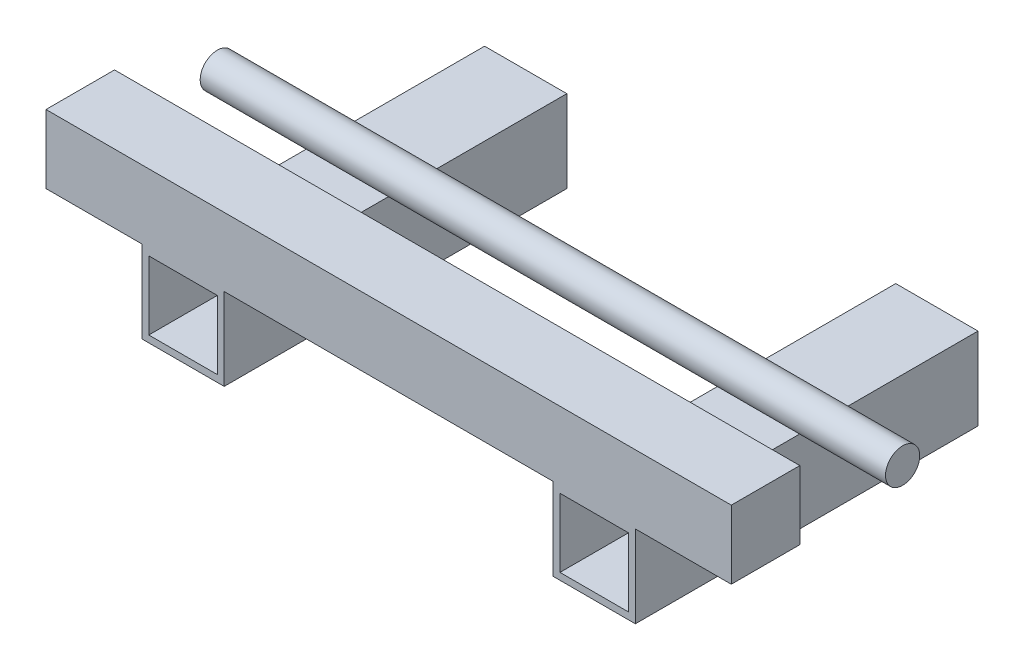
ISO-10303-21;
HEADER;
FILE_DESCRIPTION(('STEP AP214'),'2;1');
FILE_NAME('part.step','',(''),(''),'','','');
FILE_SCHEMA(('AUTOMOTIVE_DESIGN { 1 0 10303 214 1 1 1 1 }'));
ENDSEC;
DATA;
#1=APPLICATION_CONTEXT('core data for automotive mechanical design processes');
#2=APPLICATION_PROTOCOL_DEFINITION('international standard','automotive_design',2000,#1);
#3=PRODUCT_CONTEXT('',#1,'mechanical');
#4=PRODUCT('Part','Part','',(#3));
#5=PRODUCT_RELATED_PRODUCT_CATEGORY('part','',(#4));
#6=PRODUCT_DEFINITION_FORMATION('','',#4);
#7=PRODUCT_DEFINITION_CONTEXT('part definition',#1,'design');
#8=PRODUCT_DEFINITION('design','',#6,#7);
#9=PRODUCT_DEFINITION_SHAPE('','',#8);
#10=(LENGTH_UNIT() NAMED_UNIT(*) SI_UNIT(.MILLI.,.METRE.));
#11=(NAMED_UNIT(*) PLANE_ANGLE_UNIT() SI_UNIT($,.RADIAN.));
#12=(NAMED_UNIT(*) SI_UNIT($,.STERADIAN.) SOLID_ANGLE_UNIT());
#13=UNCERTAINTY_MEASURE_WITH_UNIT(LENGTH_MEASURE(1.E-05),#10,'distance_accuracy_value','');
#14=(GEOMETRIC_REPRESENTATION_CONTEXT(3) GLOBAL_UNCERTAINTY_ASSIGNED_CONTEXT((#13)) GLOBAL_UNIT_ASSIGNED_CONTEXT((#10,
#11,#12)) REPRESENTATION_CONTEXT('',''));
#15=CARTESIAN_POINT('',(0.,0.,0.));
#16=DIRECTION('',(0.,0.,1.));
#17=DIRECTION('',(1.,0.,0.));
#18=AXIS2_PLACEMENT_3D('',#15,#16,#17);
#19=CARTESIAN_POINT('',(-45.2361142751021,7.01658474681194,25.));
#20=DIRECTION('',(1.,0.,0.));
#21=DIRECTION('',(0.,0.,-1.));
#22=AXIS2_PLACEMENT_3D('',#19,#20,#21);
#23=CYLINDRICAL_SURFACE('',#22,2.5);
#24=CARTESIAN_POINT('',(-45.2361142751021,7.01658474681194,25.));
#25=DIRECTION('',(-1.,0.,0.));
#26=DIRECTION('',(0.,0.,1.));
#27=AXIS2_PLACEMENT_3D('',#24,#25,#26);
#28=CIRCLE('',#27,2.5);
#29=CARTESIAN_POINT('',(-45.2361142751021,7.01658474681194,27.5));
#30=VERTEX_POINT('',#29);
#31=EDGE_CURVE('E11',#30,#30,#28,.T.);
#32=ORIENTED_EDGE('',*,*,#31,.F.);
#33=EDGE_LOOP('',(#32));
#34=FACE_BOUND('',#33,.T.);
#35=CARTESIAN_POINT('',(54.7638857248979,7.01658474681194,25.));
#36=DIRECTION('',(-1.,0.,0.));
#37=DIRECTION('',(0.,0.,1.));
#38=AXIS2_PLACEMENT_3D('',#35,#36,#37);
#39=CIRCLE('',#38,2.5);
#40=CARTESIAN_POINT('',(54.7638857248979,7.01658474681194,27.5));
#41=VERTEX_POINT('',#40);
#42=EDGE_CURVE('E43',#41,#41,#39,.T.);
#43=ORIENTED_EDGE('',*,*,#42,.T.);
#44=EDGE_LOOP('',(#43));
#45=FACE_BOUND('',#44,.T.);
#46=ADVANCED_FACE('F40',(#34,#45),#23,.T.);
#47=CARTESIAN_POINT('',(-45.2361142751021,7.01658474681194,25.));
#48=DIRECTION('',(-1.,0.,0.));
#49=DIRECTION('',(0.,0.,1.));
#50=AXIS2_PLACEMENT_3D('',#47,#48,#49);
#51=PLANE('',#50);
#52=ORIENTED_EDGE('',*,*,#31,.T.);
#53=EDGE_LOOP('',(#52));
#54=FACE_BOUND('',#53,.T.);
#55=ADVANCED_FACE('F55',(#54),#51,.T.);
#56=CARTESIAN_POINT('',(54.7638857248979,7.01658474681194,25.));
#57=DIRECTION('',(-1.,0.,0.));
#58=DIRECTION('',(0.,0.,1.));
#59=AXIS2_PLACEMENT_3D('',#56,#57,#58);
#60=PLANE('',#59);
#61=ORIENTED_EDGE('',*,*,#42,.F.);
#62=EDGE_LOOP('',(#61));
#63=FACE_BOUND('',#62,.T.);
#64=ADVANCED_FACE('F53',(#63),#60,.F.);
#65=CLOSED_SHELL('',(#46,#55,#64));
#66=MANIFOLD_SOLID_BREP('B2',#65);
#67=CARTESIAN_POINT('',(-45.2361142751021,4.51658474681194,50.));
#68=DIRECTION('',(0.,-1.,0.));
#69=DIRECTION('',(0.,0.,-1.));
#70=AXIS2_PLACEMENT_3D('',#67,#68,#69);
#71=PLANE('',#70);
#72=DIRECTION('',(1.,0.,0.));
#73=VECTOR('',#72,1.);
#74=CARTESIAN_POINT('',(-45.2361142751021,4.51658474681194,40.));
#75=LINE('',#74,#73);
#76=CARTESIAN_POINT('',(-19.2361142751021,4.51658474681194,40.));
#77=VERTEX_POINT('',#76);
#78=CARTESIAN_POINT('',(28.7638857248979,4.51658474681194,40.));
#79=VERTEX_POINT('',#78);
#80=EDGE_CURVE('E93',#77,#79,#75,.T.);
#81=ORIENTED_EDGE('',*,*,#80,.T.);
#82=DIRECTION('',(0.,0.,-1.));
#83=VECTOR('',#82,1.);
#84=CARTESIAN_POINT('',(28.7638857248979,4.51658474681194,50.));
#85=LINE('',#84,#83);
#86=CARTESIAN_POINT('',(28.7638857248979,4.51658474681194,50.));
#87=VERTEX_POINT('',#86);
#88=EDGE_CURVE('E107',#87,#79,#85,.T.);
#89=ORIENTED_EDGE('',*,*,#88,.F.);
#90=DIRECTION('',(1.,0.,0.));
#91=VECTOR('',#90,1.);
#92=CARTESIAN_POINT('',(-45.2361142751021,4.51658474681194,50.));
#93=LINE('',#92,#91);
#94=CARTESIAN_POINT('',(-19.2361142751021,4.51658474681194,50.));
#95=VERTEX_POINT('',#94);
#96=EDGE_CURVE('E321',#95,#87,#93,.T.);
#97=ORIENTED_EDGE('',*,*,#96,.F.);
#98=DIRECTION('',(0.,0.,-1.));
#99=VECTOR('',#98,1.);
#100=CARTESIAN_POINT('',(-19.2361142751021,4.51658474681194,50.));
#101=LINE('',#100,#99);
#102=EDGE_CURVE('E392',#95,#77,#101,.T.);
#103=ORIENTED_EDGE('',*,*,#102,.T.);
#104=EDGE_LOOP('',(#81,#89,#97,#103));
#105=FACE_BOUND('',#104,.T.);
#106=ADVANCED_FACE('F80',(#105),#71,.T.);
#107=CARTESIAN_POINT('',(40.7638857248979,4.51658474681194,50.));
#108=VERTEX_POINT('',#107);
#109=CARTESIAN_POINT('',(54.7638857248979,4.51658474681194,50.));
#110=VERTEX_POINT('',#109);
#111=EDGE_CURVE('E84',#108,#110,#93,.T.);
#112=ORIENTED_EDGE('',*,*,#111,.F.);
#113=DIRECTION('',(0.,0.,-1.));
#114=VECTOR('',#113,1.);
#115=CARTESIAN_POINT('',(40.7638857248979,4.51658474681194,50.));
#116=LINE('',#115,#114);
#117=CARTESIAN_POINT('',(40.7638857248979,4.51658474681194,40.));
#118=VERTEX_POINT('',#117);
#119=EDGE_CURVE('E298',#108,#118,#116,.T.);
#120=ORIENTED_EDGE('',*,*,#119,.T.);
#121=CARTESIAN_POINT('',(54.7638857248979,4.51658474681194,40.));
#122=VERTEX_POINT('',#121);
#123=EDGE_CURVE('E308',#118,#122,#75,.T.);
#124=ORIENTED_EDGE('',*,*,#123,.T.);
#125=DIRECTION('',(0.,0.,-1.));
#126=VECTOR('',#125,1.);
#127=CARTESIAN_POINT('',(54.7638857248979,4.51658474681194,50.));
#128=LINE('',#127,#126);
#129=EDGE_CURVE('E335',#110,#122,#128,.T.);
#130=ORIENTED_EDGE('',*,*,#129,.F.);
#131=EDGE_LOOP('',(#112,#120,#124,#130));
#132=FACE_BOUND('',#131,.T.);
#133=ADVANCED_FACE('F443',(#132),#71,.T.);
#134=CARTESIAN_POINT('',(0.,0.,50.));
#135=DIRECTION('',(0.,0.,-1.));
#136=DIRECTION('',(-1.,0.,0.));
#137=AXIS2_PLACEMENT_3D('',#134,#135,#136);
#138=PLANE('',#137);
#139=DIRECTION('',(0.,-1.,0.));
#140=VECTOR('',#139,1.);
#141=CARTESIAN_POINT('',(-31.2361142751021,-7.48341525318806,50.));
#142=LINE('',#141,#140);
#143=CARTESIAN_POINT('',(-31.2361142751021,4.51658474681194,50.));
#144=VERTEX_POINT('',#143);
#145=CARTESIAN_POINT('',(-31.2361142751021,-7.48341525318806,50.));
#146=VERTEX_POINT('',#145);
#147=EDGE_CURVE('E369',#144,#146,#142,.T.);
#148=ORIENTED_EDGE('',*,*,#147,.T.);
#149=DIRECTION('',(1.,0.,0.));
#150=VECTOR('',#149,1.);
#151=CARTESIAN_POINT('',(-31.2361142751021,-7.48341525318806,50.));
#152=LINE('',#151,#150);
#153=CARTESIAN_POINT('',(-19.2361142751021,-7.48341525318806,50.));
#154=VERTEX_POINT('',#153);
#155=EDGE_CURVE('E374',#146,#154,#152,.T.);
#156=ORIENTED_EDGE('',*,*,#155,.T.);
#157=DIRECTION('',(0.,1.,0.));
#158=VECTOR('',#157,1.);
#159=CARTESIAN_POINT('',(-19.2361142751021,-7.48341525318806,50.));
#160=LINE('',#159,#158);
#161=EDGE_CURVE('E377',#154,#95,#160,.T.);
#162=ORIENTED_EDGE('',*,*,#161,.T.);
#163=ORIENTED_EDGE('',*,*,#96,.T.);
#164=DIRECTION('',(0.,-1.,0.));
#165=VECTOR('',#164,1.);
#166=CARTESIAN_POINT('',(28.7638857248979,-7.48341525318806,50.));
#167=LINE('',#166,#165);
#168=CARTESIAN_POINT('',(28.7638857248979,-7.48341525318806,50.));
#169=VERTEX_POINT('',#168);
#170=EDGE_CURVE('E278',#87,#169,#167,.T.);
#171=ORIENTED_EDGE('',*,*,#170,.T.);
#172=DIRECTION('',(1.,0.,0.));
#173=VECTOR('',#172,1.);
#174=CARTESIAN_POINT('',(28.7638857248979,-7.48341525318806,50.));
#175=LINE('',#174,#173);
#176=CARTESIAN_POINT('',(40.7638857248979,-7.48341525318806,50.));
#177=VERTEX_POINT('',#176);
#178=EDGE_CURVE('E281',#169,#177,#175,.T.);
#179=ORIENTED_EDGE('',*,*,#178,.T.);
#180=DIRECTION('',(0.,1.,0.));
#181=VECTOR('',#180,1.);
#182=CARTESIAN_POINT('',(40.7638857248979,-7.48341525318806,50.));
#183=LINE('',#182,#181);
#184=EDGE_CURVE('E284',#177,#108,#183,.T.);
#185=ORIENTED_EDGE('',*,*,#184,.T.);
#186=ORIENTED_EDGE('',*,*,#111,.T.);
#187=DIRECTION('',(0.,1.,0.));
#188=VECTOR('',#187,1.);
#189=CARTESIAN_POINT('',(54.7638857248979,4.51658474681194,50.));
#190=LINE('',#189,#188);
#191=CARTESIAN_POINT('',(54.7638857248979,14.5165847468119,50.));
#192=VERTEX_POINT('',#191);
#193=EDGE_CURVE('E316',#110,#192,#190,.T.);
#194=ORIENTED_EDGE('',*,*,#193,.T.);
#195=DIRECTION('',(1.,0.,0.));
#196=VECTOR('',#195,1.);
#197=CARTESIAN_POINT('',(-45.2361142751021,14.5165847468119,50.));
#198=LINE('',#197,#196);
#199=CARTESIAN_POINT('',(-45.2361142751021,14.5165847468119,50.));
#200=VERTEX_POINT('',#199);
#201=EDGE_CURVE('E311',#200,#192,#198,.T.);
#202=ORIENTED_EDGE('',*,*,#201,.F.);
#203=DIRECTION('',(0.,1.,0.));
#204=VECTOR('',#203,1.);
#205=CARTESIAN_POINT('',(-45.2361142751021,4.51658474681194,50.));
#206=LINE('',#205,#204);
#207=CARTESIAN_POINT('',(-45.2361142751021,4.51658474681194,50.));
#208=VERTEX_POINT('',#207);
#209=EDGE_CURVE('E307',#208,#200,#206,.T.);
#210=ORIENTED_EDGE('',*,*,#209,.F.);
#211=EDGE_CURVE('E313',#208,#144,#93,.T.);
#212=ORIENTED_EDGE('',*,*,#211,.T.);
#213=EDGE_LOOP('',(#148,#156,#162,#163,#171,#179,#185,#186,#194,#202,#210,#212));
#214=FACE_BOUND('',#213,.T.);
#215=DIRECTION('',(0.,-1.,0.));
#216=VECTOR('',#215,1.);
#217=CARTESIAN_POINT('',(-30.2361142751021,-6.48341525318806,50.));
#218=LINE('',#217,#216);
#219=CARTESIAN_POINT('',(-30.2361142751021,3.51658474681194,50.));
#220=VERTEX_POINT('',#219);
#221=CARTESIAN_POINT('',(-30.2361142751021,-6.48341525318806,50.));
#222=VERTEX_POINT('',#221);
#223=EDGE_CURVE('E694',#220,#222,#218,.T.);
#224=ORIENTED_EDGE('',*,*,#223,.F.);
#225=DIRECTION('',(-1.,0.,0.));
#226=VECTOR('',#225,1.);
#227=CARTESIAN_POINT('',(-30.2361142751021,3.51658474681194,50.));
#228=LINE('',#227,#226);
#229=CARTESIAN_POINT('',(-20.2361142751021,3.51658474681194,50.));
#230=VERTEX_POINT('',#229);
#231=EDGE_CURVE('E689',#230,#220,#228,.T.);
#232=ORIENTED_EDGE('',*,*,#231,.F.);
#233=DIRECTION('',(0.,1.,0.));
#234=VECTOR('',#233,1.);
#235=CARTESIAN_POINT('',(-20.2361142751021,-6.48341525318806,50.));
#236=LINE('',#235,#234);
#237=CARTESIAN_POINT('',(-20.2361142751021,-6.48341525318806,50.));
#238=VERTEX_POINT('',#237);
#239=EDGE_CURVE('E707',#238,#230,#236,.T.);
#240=ORIENTED_EDGE('',*,*,#239,.F.);
#241=DIRECTION('',(1.,0.,0.));
#242=VECTOR('',#241,1.);
#243=CARTESIAN_POINT('',(-30.2361142751021,-6.48341525318806,50.));
#244=LINE('',#243,#242);
#245=EDGE_CURVE('E696',#222,#238,#244,.T.);
#246=ORIENTED_EDGE('',*,*,#245,.F.);
#247=EDGE_LOOP('',(#224,#232,#240,#246));
#248=FACE_BOUND('',#247,.T.);
#249=DIRECTION('',(0.,-1.,0.));
#250=VECTOR('',#249,1.);
#251=CARTESIAN_POINT('',(29.7638857248979,-6.48341525318806,50.));
#252=LINE('',#251,#250);
#253=CARTESIAN_POINT('',(29.7638857248979,3.51658474681194,50.));
#254=VERTEX_POINT('',#253);
#255=CARTESIAN_POINT('',(29.7638857248979,-6.48341525318806,50.));
#256=VERTEX_POINT('',#255);
#257=EDGE_CURVE('E236',#254,#256,#252,.T.);
#258=ORIENTED_EDGE('',*,*,#257,.F.);
#259=DIRECTION('',(-1.,0.,0.));
#260=VECTOR('',#259,1.);
#261=CARTESIAN_POINT('',(29.7638857248979,3.51658474681194,50.));
#262=LINE('',#261,#260);
#263=CARTESIAN_POINT('',(39.7638857248979,3.51658474681194,50.));
#264=VERTEX_POINT('',#263);
#265=EDGE_CURVE('E262',#264,#254,#262,.T.);
#266=ORIENTED_EDGE('',*,*,#265,.F.);
#267=DIRECTION('',(0.,1.,0.));
#268=VECTOR('',#267,1.);
#269=CARTESIAN_POINT('',(39.7638857248979,-6.48341525318806,50.));
#270=LINE('',#269,#268);
#271=CARTESIAN_POINT('',(39.7638857248979,-6.48341525318806,50.));
#272=VERTEX_POINT('',#271);
#273=EDGE_CURVE('E260',#272,#264,#270,.T.);
#274=ORIENTED_EDGE('',*,*,#273,.F.);
#275=DIRECTION('',(1.,0.,0.));
#276=VECTOR('',#275,1.);
#277=CARTESIAN_POINT('',(29.7638857248979,-6.48341525318806,50.));
#278=LINE('',#277,#276);
#279=EDGE_CURVE('E246',#256,#272,#278,.T.);
#280=ORIENTED_EDGE('',*,*,#279,.F.);
#281=EDGE_LOOP('',(#258,#266,#274,#280));
#282=FACE_BOUND('',#281,.T.);
#283=ADVANCED_FACE('F258',(#214,#248,#282),#138,.F.);
#284=CARTESIAN_POINT('',(0.,0.,0.));
#285=DIRECTION('',(0.,0.,-1.));
#286=DIRECTION('',(-1.,0.,0.));
#287=AXIS2_PLACEMENT_3D('',#284,#285,#286);
#288=PLANE('',#287);
#289=DIRECTION('',(0.,-1.,0.));
#290=VECTOR('',#289,1.);
#291=CARTESIAN_POINT('',(-31.2361142751021,-7.48341525318806,0.));
#292=LINE('',#291,#290);
#293=CARTESIAN_POINT('',(-31.2361142751021,4.51658474681194,0.));
#294=VERTEX_POINT('',#293);
#295=CARTESIAN_POINT('',(-31.2361142751021,-7.48341525318806,0.));
#296=VERTEX_POINT('',#295);
#297=EDGE_CURVE('E406',#294,#296,#292,.T.);
#298=ORIENTED_EDGE('',*,*,#297,.F.);
#299=DIRECTION('',(-1.,0.,0.));
#300=VECTOR('',#299,1.);
#301=CARTESIAN_POINT('',(-31.2361142751021,4.51658474681194,0.));
#302=LINE('',#301,#300);
#303=CARTESIAN_POINT('',(-19.2361142751021,4.51658474681194,0.));
#304=VERTEX_POINT('',#303);
#305=EDGE_CURVE('E375',#304,#294,#302,.T.);
#306=ORIENTED_EDGE('',*,*,#305,.F.);
#307=DIRECTION('',(0.,1.,0.));
#308=VECTOR('',#307,1.);
#309=CARTESIAN_POINT('',(-19.2361142751021,-7.48341525318806,0.));
#310=LINE('',#309,#308);
#311=CARTESIAN_POINT('',(-19.2361142751021,-7.48341525318806,0.));
#312=VERTEX_POINT('',#311);
#313=EDGE_CURVE('E380',#312,#304,#310,.T.);
#314=ORIENTED_EDGE('',*,*,#313,.F.);
#315=DIRECTION('',(1.,0.,0.));
#316=VECTOR('',#315,1.);
#317=CARTESIAN_POINT('',(-31.2361142751021,-7.48341525318806,0.));
#318=LINE('',#317,#316);
#319=EDGE_CURVE('E404',#296,#312,#318,.T.);
#320=ORIENTED_EDGE('',*,*,#319,.F.);
#321=EDGE_LOOP('',(#298,#306,#314,#320));
#322=FACE_BOUND('',#321,.T.);
#323=DIRECTION('',(-1.,0.,0.));
#324=VECTOR('',#323,1.);
#325=CARTESIAN_POINT('',(-30.2361142751021,3.51658474681194,0.));
#326=LINE('',#325,#324);
#327=CARTESIAN_POINT('',(-20.2361142751021,3.51658474681194,0.));
#328=VERTEX_POINT('',#327);
#329=CARTESIAN_POINT('',(-30.2361142751021,3.51658474681194,0.));
#330=VERTEX_POINT('',#329);
#331=EDGE_CURVE('E686',#328,#330,#326,.T.);
#332=ORIENTED_EDGE('',*,*,#331,.T.);
#333=DIRECTION('',(0.,-1.,0.));
#334=VECTOR('',#333,1.);
#335=CARTESIAN_POINT('',(-30.2361142751021,-6.48341525318806,0.));
#336=LINE('',#335,#334);
#337=CARTESIAN_POINT('',(-30.2361142751021,-6.48341525318806,0.));
#338=VERTEX_POINT('',#337);
#339=EDGE_CURVE('E338',#330,#338,#336,.T.);
#340=ORIENTED_EDGE('',*,*,#339,.T.);
#341=DIRECTION('',(1.,0.,0.));
#342=VECTOR('',#341,1.);
#343=CARTESIAN_POINT('',(-30.2361142751021,-6.48341525318806,0.));
#344=LINE('',#343,#342);
#345=CARTESIAN_POINT('',(-20.2361142751021,-6.48341525318806,0.));
#346=VERTEX_POINT('',#345);
#347=EDGE_CURVE('E684',#338,#346,#344,.T.);
#348=ORIENTED_EDGE('',*,*,#347,.T.);
#349=DIRECTION('',(0.,1.,0.));
#350=VECTOR('',#349,1.);
#351=CARTESIAN_POINT('',(-20.2361142751021,-6.48341525318806,0.));
#352=LINE('',#351,#350);
#353=EDGE_CURVE('E693',#346,#328,#352,.T.);
#354=ORIENTED_EDGE('',*,*,#353,.T.);
#355=EDGE_LOOP('',(#332,#340,#348,#354));
#356=FACE_BOUND('',#355,.T.);
#357=ADVANCED_FACE('F423',(#322,#356),#288,.T.);
#358=CARTESIAN_POINT('',(-31.2361142751021,-7.48341525318806,50.));
#359=DIRECTION('',(1.,0.,0.));
#360=DIRECTION('',(0.,0.,-1.));
#361=AXIS2_PLACEMENT_3D('',#358,#359,#360);
#362=PLANE('',#361);
#363=ORIENTED_EDGE('',*,*,#297,.T.);
#364=DIRECTION('',(0.,0.,-1.));
#365=VECTOR('',#364,1.);
#366=CARTESIAN_POINT('',(-31.2361142751021,-7.48341525318806,50.));
#367=LINE('',#366,#365);
#368=EDGE_CURVE('E90',#146,#296,#367,.T.);
#369=ORIENTED_EDGE('',*,*,#368,.F.);
#370=ORIENTED_EDGE('',*,*,#147,.F.);
#371=DIRECTION('',(0.,0.,-1.));
#372=VECTOR('',#371,1.);
#373=CARTESIAN_POINT('',(-31.2361142751021,4.51658474681194,50.));
#374=LINE('',#373,#372);
#375=CARTESIAN_POINT('',(-31.2361142751021,4.51658474681194,40.));
#376=VERTEX_POINT('',#375);
#377=EDGE_CURVE('E367',#144,#376,#374,.T.);
#378=ORIENTED_EDGE('',*,*,#377,.T.);
#379=EDGE_CURVE('E390',#376,#294,#374,.T.);
#380=ORIENTED_EDGE('',*,*,#379,.T.);
#381=EDGE_LOOP('',(#363,#369,#370,#378,#380));
#382=FACE_BOUND('',#381,.T.);
#383=ADVANCED_FACE('F82',(#382),#362,.F.);
#384=CARTESIAN_POINT('',(-31.2361142751021,-7.48341525318806,50.));
#385=DIRECTION('',(0.,1.,0.));
#386=DIRECTION('',(0.,0.,1.));
#387=AXIS2_PLACEMENT_3D('',#384,#385,#386);
#388=PLANE('',#387);
#389=ORIENTED_EDGE('',*,*,#319,.T.);
#390=DIRECTION('',(0.,0.,-1.));
#391=VECTOR('',#390,1.);
#392=CARTESIAN_POINT('',(-19.2361142751021,-7.48341525318806,50.));
#393=LINE('',#392,#391);
#394=EDGE_CURVE('E395',#154,#312,#393,.T.);
#395=ORIENTED_EDGE('',*,*,#394,.F.);
#396=ORIENTED_EDGE('',*,*,#155,.F.);
#397=ORIENTED_EDGE('',*,*,#368,.T.);
#398=EDGE_LOOP('',(#389,#395,#396,#397));
#399=FACE_BOUND('',#398,.T.);
#400=ADVANCED_FACE('F402',(#399),#388,.F.);
#401=CARTESIAN_POINT('',(-19.2361142751021,-7.48341525318806,50.));
#402=DIRECTION('',(-1.,0.,0.));
#403=DIRECTION('',(0.,0.,1.));
#404=AXIS2_PLACEMENT_3D('',#401,#402,#403);
#405=PLANE('',#404);
#406=ORIENTED_EDGE('',*,*,#313,.T.);
#407=EDGE_CURVE('E396',#77,#304,#101,.T.);
#408=ORIENTED_EDGE('',*,*,#407,.F.);
#409=ORIENTED_EDGE('',*,*,#102,.F.);
#410=ORIENTED_EDGE('',*,*,#161,.F.);
#411=ORIENTED_EDGE('',*,*,#394,.T.);
#412=EDGE_LOOP('',(#406,#408,#409,#410,#411));
#413=FACE_BOUND('',#412,.T.);
#414=ADVANCED_FACE('F420',(#413),#405,.F.);
#415=CARTESIAN_POINT('',(-31.2361142751021,4.51658474681194,50.));
#416=DIRECTION('',(0.,-1.,0.));
#417=DIRECTION('',(1.,0.,0.));
#418=AXIS2_PLACEMENT_3D('',#415,#416,#417);
#419=PLANE('',#418);
#420=ORIENTED_EDGE('',*,*,#407,.T.);
#421=ORIENTED_EDGE('',*,*,#305,.T.);
#422=ORIENTED_EDGE('',*,*,#379,.F.);
#423=EDGE_CURVE('E38',#376,#77,#75,.T.);
#424=ORIENTED_EDGE('',*,*,#423,.T.);
#425=EDGE_LOOP('',(#420,#421,#422,#424));
#426=FACE_BOUND('',#425,.T.);
#427=ADVANCED_FACE('F426',(#426),#419,.F.);
#428=CARTESIAN_POINT('',(-30.2361142751021,-6.48341525318806,50.));
#429=DIRECTION('',(1.,0.,0.));
#430=DIRECTION('',(0.,0.,-1.));
#431=AXIS2_PLACEMENT_3D('',#428,#429,#430);
#432=PLANE('',#431);
#433=ORIENTED_EDGE('',*,*,#339,.F.);
#434=DIRECTION('',(0.,0.,-1.));
#435=VECTOR('',#434,1.);
#436=CARTESIAN_POINT('',(-30.2361142751021,3.51658474681194,50.));
#437=LINE('',#436,#435);
#438=EDGE_CURVE('E679',#220,#330,#437,.T.);
#439=ORIENTED_EDGE('',*,*,#438,.F.);
#440=ORIENTED_EDGE('',*,*,#223,.T.);
#441=DIRECTION('',(0.,0.,-1.));
#442=VECTOR('',#441,1.);
#443=CARTESIAN_POINT('',(-30.2361142751021,-6.48341525318806,50.));
#444=LINE('',#443,#442);
#445=EDGE_CURVE('E409',#222,#338,#444,.T.);
#446=ORIENTED_EDGE('',*,*,#445,.T.);
#447=EDGE_LOOP('',(#433,#439,#440,#446));
#448=FACE_BOUND('',#447,.T.);
#449=ADVANCED_FACE('F496',(#448),#432,.T.);
#450=CARTESIAN_POINT('',(-30.2361142751021,-6.48341525318806,50.));
#451=DIRECTION('',(0.,1.,0.));
#452=DIRECTION('',(-1.,0.,0.));
#453=AXIS2_PLACEMENT_3D('',#450,#451,#452);
#454=PLANE('',#453);
#455=ORIENTED_EDGE('',*,*,#347,.F.);
#456=ORIENTED_EDGE('',*,*,#445,.F.);
#457=ORIENTED_EDGE('',*,*,#245,.T.);
#458=DIRECTION('',(0.,0.,-1.));
#459=VECTOR('',#458,1.);
#460=CARTESIAN_POINT('',(-20.2361142751021,-6.48341525318806,50.));
#461=LINE('',#460,#459);
#462=EDGE_CURVE('E413',#238,#346,#461,.T.);
#463=ORIENTED_EDGE('',*,*,#462,.T.);
#464=EDGE_LOOP('',(#455,#456,#457,#463));
#465=FACE_BOUND('',#464,.T.);
#466=ADVANCED_FACE('F487',(#465),#454,.T.);
#467=CARTESIAN_POINT('',(-20.2361142751021,-6.48341525318806,50.));
#468=DIRECTION('',(-1.,0.,0.));
#469=DIRECTION('',(0.,0.,1.));
#470=AXIS2_PLACEMENT_3D('',#467,#468,#469);
#471=PLANE('',#470);
#472=ORIENTED_EDGE('',*,*,#353,.F.);
#473=ORIENTED_EDGE('',*,*,#462,.F.);
#474=ORIENTED_EDGE('',*,*,#239,.T.);
#475=DIRECTION('',(0.,0.,-1.));
#476=VECTOR('',#475,1.);
#477=CARTESIAN_POINT('',(-20.2361142751021,3.51658474681194,50.));
#478=LINE('',#477,#476);
#479=EDGE_CURVE('E690',#230,#328,#478,.T.);
#480=ORIENTED_EDGE('',*,*,#479,.T.);
#481=EDGE_LOOP('',(#472,#473,#474,#480));
#482=FACE_BOUND('',#481,.T.);
#483=ADVANCED_FACE('F481',(#482),#471,.T.);
#484=CARTESIAN_POINT('',(-30.2361142751021,3.51658474681194,50.));
#485=DIRECTION('',(0.,-1.,0.));
#486=DIRECTION('',(0.,0.,-1.));
#487=AXIS2_PLACEMENT_3D('',#484,#485,#486);
#488=PLANE('',#487);
#489=ORIENTED_EDGE('',*,*,#331,.F.);
#490=ORIENTED_EDGE('',*,*,#479,.F.);
#491=ORIENTED_EDGE('',*,*,#231,.T.);
#492=ORIENTED_EDGE('',*,*,#438,.T.);
#493=EDGE_LOOP('',(#489,#490,#491,#492));
#494=FACE_BOUND('',#493,.T.);
#495=ADVANCED_FACE('F475',(#494),#488,.T.);
#496=ORIENTED_EDGE('',*,*,#377,.F.);
#497=ORIENTED_EDGE('',*,*,#211,.F.);
#498=DIRECTION('',(0.,0.,-1.));
#499=VECTOR('',#498,1.);
#500=CARTESIAN_POINT('',(-45.2361142751021,4.51658474681194,50.));
#501=LINE('',#500,#499);
#502=CARTESIAN_POINT('',(-45.2361142751021,4.51658474681194,40.));
#503=VERTEX_POINT('',#502);
#504=EDGE_CURVE('E326',#208,#503,#501,.T.);
#505=ORIENTED_EDGE('',*,*,#504,.T.);
#506=EDGE_CURVE('E92',#503,#376,#75,.T.);
#507=ORIENTED_EDGE('',*,*,#506,.T.);
#508=EDGE_LOOP('',(#496,#497,#505,#507));
#509=FACE_BOUND('',#508,.T.);
#510=ADVANCED_FACE('F364',(#509),#71,.T.);
#511=CARTESIAN_POINT('',(-45.2361142751021,14.5165847468119,50.));
#512=DIRECTION('',(0.,-1.,0.));
#513=DIRECTION('',(0.,0.,-1.));
#514=AXIS2_PLACEMENT_3D('',#511,#512,#513);
#515=PLANE('',#514);
#516=DIRECTION('',(0.,0.,-1.));
#517=VECTOR('',#516,1.);
#518=CARTESIAN_POINT('',(54.7638857248979,14.5165847468119,50.));
#519=LINE('',#518,#517);
#520=CARTESIAN_POINT('',(54.7638857248979,14.5165847468119,40.));
#521=VERTEX_POINT('',#520);
#522=EDGE_CURVE('E341',#192,#521,#519,.T.);
#523=ORIENTED_EDGE('',*,*,#522,.T.);
#524=DIRECTION('',(1.,0.,0.));
#525=VECTOR('',#524,1.);
#526=CARTESIAN_POINT('',(-45.2361142751021,14.5165847468119,40.));
#527=LINE('',#526,#525);
#528=CARTESIAN_POINT('',(-45.2361142751021,14.5165847468119,40.));
#529=VERTEX_POINT('',#528);
#530=EDGE_CURVE('E309',#529,#521,#527,.T.);
#531=ORIENTED_EDGE('',*,*,#530,.F.);
#532=DIRECTION('',(0.,0.,-1.));
#533=VECTOR('',#532,1.);
#534=CARTESIAN_POINT('',(-45.2361142751021,14.5165847468119,50.));
#535=LINE('',#534,#533);
#536=EDGE_CURVE('E332',#200,#529,#535,.T.);
#537=ORIENTED_EDGE('',*,*,#536,.F.);
#538=ORIENTED_EDGE('',*,*,#201,.T.);
#539=EDGE_LOOP('',(#523,#531,#537,#538));
#540=FACE_BOUND('',#539,.T.);
#541=ADVANCED_FACE('F354',(#540),#515,.F.);
#542=CARTESIAN_POINT('',(-45.2361142751021,4.51658474681194,40.));
#543=DIRECTION('',(0.,0.,-1.));
#544=DIRECTION('',(-1.,0.,0.));
#545=AXIS2_PLACEMENT_3D('',#542,#543,#544);
#546=PLANE('',#545);
#547=DIRECTION('',(0.,1.,0.));
#548=VECTOR('',#547,1.);
#549=CARTESIAN_POINT('',(54.7638857248979,4.51658474681194,40.));
#550=LINE('',#549,#548);
#551=EDGE_CURVE('E339',#122,#521,#550,.T.);
#552=ORIENTED_EDGE('',*,*,#551,.F.);
#553=ORIENTED_EDGE('',*,*,#123,.F.);
#554=EDGE_CURVE('E428',#79,#118,#75,.T.);
#555=ORIENTED_EDGE('',*,*,#554,.F.);
#556=ORIENTED_EDGE('',*,*,#80,.F.);
#557=ORIENTED_EDGE('',*,*,#423,.F.);
#558=ORIENTED_EDGE('',*,*,#506,.F.);
#559=DIRECTION('',(0.,1.,0.));
#560=VECTOR('',#559,1.);
#561=CARTESIAN_POINT('',(-45.2361142751021,4.51658474681194,40.));
#562=LINE('',#561,#560);
#563=EDGE_CURVE('E329',#503,#529,#562,.T.);
#564=ORIENTED_EDGE('',*,*,#563,.T.);
#565=ORIENTED_EDGE('',*,*,#530,.T.);
#566=EDGE_LOOP('',(#552,#553,#555,#556,#557,#558,#564,#565));
#567=FACE_BOUND('',#566,.T.);
#568=ADVANCED_FACE('F358',(#567),#546,.T.);
#569=CARTESIAN_POINT('',(-45.2361142751021,0.,0.));
#570=DIRECTION('',(1.,0.,0.));
#571=DIRECTION('',(0.,0.,-1.));
#572=AXIS2_PLACEMENT_3D('',#569,#570,#571);
#573=PLANE('',#572);
#574=ORIENTED_EDGE('',*,*,#504,.F.);
#575=ORIENTED_EDGE('',*,*,#209,.T.);
#576=ORIENTED_EDGE('',*,*,#536,.T.);
#577=ORIENTED_EDGE('',*,*,#563,.F.);
#578=EDGE_LOOP('',(#574,#575,#576,#577));
#579=FACE_BOUND('',#578,.T.);
#580=ADVANCED_FACE('F362',(#579),#573,.F.);
#581=CARTESIAN_POINT('',(54.7638857248979,0.,0.));
#582=DIRECTION('',(1.,0.,0.));
#583=DIRECTION('',(0.,0.,-1.));
#584=AXIS2_PLACEMENT_3D('',#581,#582,#583);
#585=PLANE('',#584);
#586=ORIENTED_EDGE('',*,*,#129,.T.);
#587=ORIENTED_EDGE('',*,*,#551,.T.);
#588=ORIENTED_EDGE('',*,*,#522,.F.);
#589=ORIENTED_EDGE('',*,*,#193,.F.);
#590=EDGE_LOOP('',(#586,#587,#588,#589));
#591=FACE_BOUND('',#590,.T.);
#592=ADVANCED_FACE('F355',(#591),#585,.T.);
#593=CARTESIAN_POINT('',(0.,0.,0.));
#594=DIRECTION('',(0.,0.,-1.));
#595=DIRECTION('',(-1.,0.,0.));
#596=AXIS2_PLACEMENT_3D('',#593,#594,#595);
#597=PLANE('',#596);
#598=DIRECTION('',(0.,-1.,0.));
#599=VECTOR('',#598,1.);
#600=CARTESIAN_POINT('',(28.7638857248979,-7.48341525318806,0.));
#601=LINE('',#600,#599);
#602=CARTESIAN_POINT('',(28.7638857248979,4.51658474681194,0.));
#603=VERTEX_POINT('',#602);
#604=CARTESIAN_POINT('',(28.7638857248979,-7.48341525318806,0.));
#605=VERTEX_POINT('',#604);
#606=EDGE_CURVE('E254',#603,#605,#601,.T.);
#607=ORIENTED_EDGE('',*,*,#606,.F.);
#608=DIRECTION('',(-1.,0.,0.));
#609=VECTOR('',#608,1.);
#610=CARTESIAN_POINT('',(28.7638857248979,4.51658474681194,0.));
#611=LINE('',#610,#609);
#612=CARTESIAN_POINT('',(40.7638857248979,4.51658474681194,0.));
#613=VERTEX_POINT('',#612);
#614=EDGE_CURVE('E282',#613,#603,#611,.T.);
#615=ORIENTED_EDGE('',*,*,#614,.F.);
#616=DIRECTION('',(0.,1.,0.));
#617=VECTOR('',#616,1.);
#618=CARTESIAN_POINT('',(40.7638857248979,-7.48341525318806,0.));
#619=LINE('',#618,#617);
#620=CARTESIAN_POINT('',(40.7638857248979,-7.48341525318806,0.));
#621=VERTEX_POINT('',#620);
#622=EDGE_CURVE('E291',#621,#613,#619,.T.);
#623=ORIENTED_EDGE('',*,*,#622,.F.);
#624=DIRECTION('',(1.,0.,0.));
#625=VECTOR('',#624,1.);
#626=CARTESIAN_POINT('',(28.7638857248979,-7.48341525318806,0.));
#627=LINE('',#626,#625);
#628=EDGE_CURVE('E289',#605,#621,#627,.T.);
#629=ORIENTED_EDGE('',*,*,#628,.F.);
#630=EDGE_LOOP('',(#607,#615,#623,#629));
#631=FACE_BOUND('',#630,.T.);
#632=DIRECTION('',(-1.,0.,0.));
#633=VECTOR('',#632,1.);
#634=CARTESIAN_POINT('',(29.7638857248979,3.51658474681194,0.));
#635=LINE('',#634,#633);
#636=CARTESIAN_POINT('',(39.7638857248979,3.51658474681194,0.));
#637=VERTEX_POINT('',#636);
#638=CARTESIAN_POINT('',(29.7638857248979,3.51658474681194,0.));
#639=VERTEX_POINT('',#638);
#640=EDGE_CURVE('E247',#637,#639,#635,.T.);
#641=ORIENTED_EDGE('',*,*,#640,.T.);
#642=DIRECTION('',(0.,-1.,0.));
#643=VECTOR('',#642,1.);
#644=CARTESIAN_POINT('',(29.7638857248979,-6.48341525318806,0.));
#645=LINE('',#644,#643);
#646=CARTESIAN_POINT('',(29.7638857248979,-6.48341525318806,0.));
#647=VERTEX_POINT('',#646);
#648=EDGE_CURVE('E266',#639,#647,#645,.T.);
#649=ORIENTED_EDGE('',*,*,#648,.T.);
#650=DIRECTION('',(1.,0.,0.));
#651=VECTOR('',#650,1.);
#652=CARTESIAN_POINT('',(29.7638857248979,-6.48341525318806,0.));
#653=LINE('',#652,#651);
#654=CARTESIAN_POINT('',(39.7638857248979,-6.48341525318806,0.));
#655=VERTEX_POINT('',#654);
#656=EDGE_CURVE('E253',#647,#655,#653,.T.);
#657=ORIENTED_EDGE('',*,*,#656,.T.);
#658=DIRECTION('',(0.,1.,0.));
#659=VECTOR('',#658,1.);
#660=CARTESIAN_POINT('',(39.7638857248979,-6.48341525318806,0.));
#661=LINE('',#660,#659);
#662=EDGE_CURVE('E269',#655,#637,#661,.T.);
#663=ORIENTED_EDGE('',*,*,#662,.T.);
#664=EDGE_LOOP('',(#641,#649,#657,#663));
#665=FACE_BOUND('',#664,.T.);
#666=ADVANCED_FACE('F449',(#631,#665),#597,.T.);
#667=CARTESIAN_POINT('',(28.7638857248979,-7.48341525318806,50.));
#668=DIRECTION('',(1.,0.,0.));
#669=DIRECTION('',(0.,0.,-1.));
#670=AXIS2_PLACEMENT_3D('',#667,#668,#669);
#671=PLANE('',#670);
#672=ORIENTED_EDGE('',*,*,#606,.T.);
#673=DIRECTION('',(0.,0.,-1.));
#674=VECTOR('',#673,1.);
#675=CARTESIAN_POINT('',(28.7638857248979,-7.48341525318806,50.));
#676=LINE('',#675,#674);
#677=EDGE_CURVE('E303',#169,#605,#676,.T.);
#678=ORIENTED_EDGE('',*,*,#677,.F.);
#679=ORIENTED_EDGE('',*,*,#170,.F.);
#680=ORIENTED_EDGE('',*,*,#88,.T.);
#681=EDGE_CURVE('E286',#79,#603,#85,.T.);
#682=ORIENTED_EDGE('',*,*,#681,.T.);
#683=EDGE_LOOP('',(#672,#678,#679,#680,#682));
#684=FACE_BOUND('',#683,.T.);
#685=ADVANCED_FACE('F433',(#684),#671,.F.);
#686=CARTESIAN_POINT('',(28.7638857248979,-7.48341525318806,50.));
#687=DIRECTION('',(0.,1.,0.));
#688=DIRECTION('',(0.,0.,1.));
#689=AXIS2_PLACEMENT_3D('',#686,#687,#688);
#690=PLANE('',#689);
#691=ORIENTED_EDGE('',*,*,#628,.T.);
#692=DIRECTION('',(0.,0.,-1.));
#693=VECTOR('',#692,1.);
#694=CARTESIAN_POINT('',(40.7638857248979,-7.48341525318806,50.));
#695=LINE('',#694,#693);
#696=EDGE_CURVE('E300',#177,#621,#695,.T.);
#697=ORIENTED_EDGE('',*,*,#696,.F.);
#698=ORIENTED_EDGE('',*,*,#178,.F.);
#699=ORIENTED_EDGE('',*,*,#677,.T.);
#700=EDGE_LOOP('',(#691,#697,#698,#699));
#701=FACE_BOUND('',#700,.T.);
#702=ADVANCED_FACE('F436',(#701),#690,.F.);
#703=CARTESIAN_POINT('',(40.7638857248979,-7.48341525318806,50.));
#704=DIRECTION('',(-1.,0.,0.));
#705=DIRECTION('',(0.,0.,1.));
#706=AXIS2_PLACEMENT_3D('',#703,#704,#705);
#707=PLANE('',#706);
#708=ORIENTED_EDGE('',*,*,#622,.T.);
#709=EDGE_CURVE('E297',#118,#613,#116,.T.);
#710=ORIENTED_EDGE('',*,*,#709,.F.);
#711=ORIENTED_EDGE('',*,*,#119,.F.);
#712=ORIENTED_EDGE('',*,*,#184,.F.);
#713=ORIENTED_EDGE('',*,*,#696,.T.);
#714=EDGE_LOOP('',(#708,#710,#711,#712,#713));
#715=FACE_BOUND('',#714,.T.);
#716=ADVANCED_FACE('F442',(#715),#707,.F.);
#717=CARTESIAN_POINT('',(28.7638857248979,4.51658474681194,50.));
#718=DIRECTION('',(0.,-1.,0.));
#719=DIRECTION('',(0.,0.,-1.));
#720=AXIS2_PLACEMENT_3D('',#717,#718,#719);
#721=PLANE('',#720);
#722=ORIENTED_EDGE('',*,*,#709,.T.);
#723=ORIENTED_EDGE('',*,*,#614,.T.);
#724=ORIENTED_EDGE('',*,*,#681,.F.);
#725=ORIENTED_EDGE('',*,*,#554,.T.);
#726=EDGE_LOOP('',(#722,#723,#724,#725));
#727=FACE_BOUND('',#726,.T.);
#728=ADVANCED_FACE('F445',(#727),#721,.F.);
#729=CARTESIAN_POINT('',(29.7638857248979,-6.48341525318806,50.));
#730=DIRECTION('',(1.,0.,0.));
#731=DIRECTION('',(0.,0.,-1.));
#732=AXIS2_PLACEMENT_3D('',#729,#730,#731);
#733=PLANE('',#732);
#734=ORIENTED_EDGE('',*,*,#648,.F.);
#735=DIRECTION('',(0.,0.,-1.));
#736=VECTOR('',#735,1.);
#737=CARTESIAN_POINT('',(29.7638857248979,3.51658474681194,50.));
#738=LINE('',#737,#736);
#739=EDGE_CURVE('E242',#254,#639,#738,.T.);
#740=ORIENTED_EDGE('',*,*,#739,.F.);
#741=ORIENTED_EDGE('',*,*,#257,.T.);
#742=DIRECTION('',(0.,0.,-1.));
#743=VECTOR('',#742,1.);
#744=CARTESIAN_POINT('',(29.7638857248979,-6.48341525318806,50.));
#745=LINE('',#744,#743);
#746=EDGE_CURVE('E239',#256,#647,#745,.T.);
#747=ORIENTED_EDGE('',*,*,#746,.T.);
#748=EDGE_LOOP('',(#734,#740,#741,#747));
#749=FACE_BOUND('',#748,.T.);
#750=ADVANCED_FACE('F238',(#749),#733,.T.);
#751=CARTESIAN_POINT('',(29.7638857248979,-6.48341525318806,50.));
#752=DIRECTION('',(0.,1.,0.));
#753=DIRECTION('',(0.,0.,1.));
#754=AXIS2_PLACEMENT_3D('',#751,#752,#753);
#755=PLANE('',#754);
#756=ORIENTED_EDGE('',*,*,#656,.F.);
#757=ORIENTED_EDGE('',*,*,#746,.F.);
#758=ORIENTED_EDGE('',*,*,#279,.T.);
#759=DIRECTION('',(0.,0.,-1.));
#760=VECTOR('',#759,1.);
#761=CARTESIAN_POINT('',(39.7638857248979,-6.48341525318806,50.));
#762=LINE('',#761,#760);
#763=EDGE_CURVE('E255',#272,#655,#762,.T.);
#764=ORIENTED_EDGE('',*,*,#763,.T.);
#765=EDGE_LOOP('',(#756,#757,#758,#764));
#766=FACE_BOUND('',#765,.T.);
#767=ADVANCED_FACE('F250',(#766),#755,.T.);
#768=CARTESIAN_POINT('',(39.7638857248979,-6.48341525318806,50.));
#769=DIRECTION('',(-1.,0.,0.));
#770=DIRECTION('',(0.,0.,1.));
#771=AXIS2_PLACEMENT_3D('',#768,#769,#770);
#772=PLANE('',#771);
#773=ORIENTED_EDGE('',*,*,#662,.F.);
#774=ORIENTED_EDGE('',*,*,#763,.F.);
#775=ORIENTED_EDGE('',*,*,#273,.T.);
#776=DIRECTION('',(0.,0.,-1.));
#777=VECTOR('',#776,1.);
#778=CARTESIAN_POINT('',(39.7638857248979,3.51658474681194,50.));
#779=LINE('',#778,#777);
#780=EDGE_CURVE('E275',#264,#637,#779,.T.);
#781=ORIENTED_EDGE('',*,*,#780,.T.);
#782=EDGE_LOOP('',(#773,#774,#775,#781));
#783=FACE_BOUND('',#782,.T.);
#784=ADVANCED_FACE('F458',(#783),#772,.T.);
#785=CARTESIAN_POINT('',(29.7638857248979,3.51658474681194,50.));
#786=DIRECTION('',(0.,-1.,0.));
#787=DIRECTION('',(0.,0.,-1.));
#788=AXIS2_PLACEMENT_3D('',#785,#786,#787);
#789=PLANE('',#788);
#790=ORIENTED_EDGE('',*,*,#640,.F.);
#791=ORIENTED_EDGE('',*,*,#780,.F.);
#792=ORIENTED_EDGE('',*,*,#265,.T.);
#793=ORIENTED_EDGE('',*,*,#739,.T.);
#794=EDGE_LOOP('',(#790,#791,#792,#793));
#795=FACE_BOUND('',#794,.T.);
#796=ADVANCED_FACE('F456',(#795),#789,.T.);
#797=CLOSED_SHELL('',(#106,#133,#283,#357,#383,#400,#414,#427,#449,#466,#483,#495,#510,#541,
#568,#580,#592,#666,#685,#702,#716,#728,#750,#767,#784,#796));
#798=MANIFOLD_SOLID_BREP('B6',#797);
#799=ADVANCED_BREP_SHAPE_REPRESENTATION('',(#18,#66,#798),#14);
#800=SHAPE_DEFINITION_REPRESENTATION(#9,#799);
ENDSEC;
END-ISO-10303-21;
